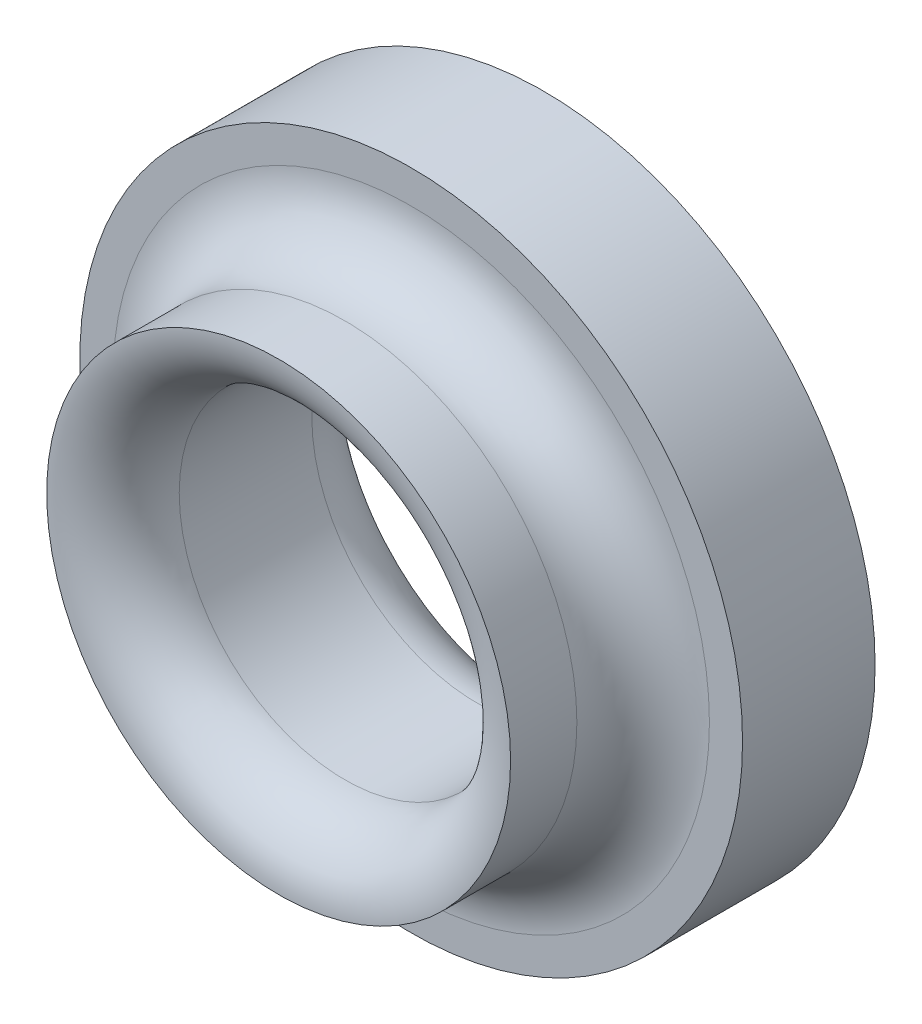
ISO-10303-21;
HEADER;
FILE_DESCRIPTION(('STEP AP214'),'2;1');
FILE_NAME('part.step','',(''),(''),'','','');
FILE_SCHEMA(('AUTOMOTIVE_DESIGN { 1 0 10303 214 1 1 1 1 }'));
ENDSEC;
DATA;
#1=APPLICATION_CONTEXT('core data for automotive mechanical design processes');
#2=APPLICATION_PROTOCOL_DEFINITION('international standard','automotive_design',2000,#1);
#3=PRODUCT_CONTEXT('',#1,'mechanical');
#4=PRODUCT('Part','Part','',(#3));
#5=PRODUCT_RELATED_PRODUCT_CATEGORY('part','',(#4));
#6=PRODUCT_DEFINITION_FORMATION('','',#4);
#7=PRODUCT_DEFINITION_CONTEXT('part definition',#1,'design');
#8=PRODUCT_DEFINITION('design','',#6,#7);
#9=PRODUCT_DEFINITION_SHAPE('','',#8);
#10=(LENGTH_UNIT() NAMED_UNIT(*) SI_UNIT(.MILLI.,.METRE.));
#11=(NAMED_UNIT(*) PLANE_ANGLE_UNIT() SI_UNIT($,.RADIAN.));
#12=(NAMED_UNIT(*) SI_UNIT($,.STERADIAN.) SOLID_ANGLE_UNIT());
#13=UNCERTAINTY_MEASURE_WITH_UNIT(LENGTH_MEASURE(1.E-05),#10,'distance_accuracy_value','');
#14=(GEOMETRIC_REPRESENTATION_CONTEXT(3) GLOBAL_UNCERTAINTY_ASSIGNED_CONTEXT((#13)) GLOBAL_UNIT_ASSIGNED_CONTEXT((#10,
#11,#12)) REPRESENTATION_CONTEXT('',''));
#15=CARTESIAN_POINT('',(0.,0.,0.));
#16=DIRECTION('',(0.,0.,1.));
#17=DIRECTION('',(1.,0.,0.));
#18=AXIS2_PLACEMENT_3D('',#15,#16,#17);
#19=CARTESIAN_POINT('',(0.,0.,2.));
#20=DIRECTION('',(0.,0.,-1.));
#21=DIRECTION('',(-1.,0.,0.));
#22=AXIS2_PLACEMENT_3D('',#19,#20,#21);
#23=CYLINDRICAL_SURFACE('',#22,5.);
#24=CARTESIAN_POINT('',(0.,0.,2.));
#25=DIRECTION('',(0.,0.,1.));
#26=DIRECTION('',(1.,0.,0.));
#27=AXIS2_PLACEMENT_3D('',#24,#25,#26);
#28=CIRCLE('',#27,5.);
#29=CARTESIAN_POINT('',(5.,0.,2.));
#30=VERTEX_POINT('',#29);
#31=EDGE_CURVE('E53',#30,#30,#28,.T.);
#32=ORIENTED_EDGE('',*,*,#31,.F.);
#33=EDGE_LOOP('',(#32));
#34=FACE_BOUND('',#33,.T.);
#35=CARTESIAN_POINT('',(0.,0.,0.));
#36=DIRECTION('',(0.,0.,1.));
#37=DIRECTION('',(1.,0.,0.));
#38=AXIS2_PLACEMENT_3D('',#35,#36,#37);
#39=CIRCLE('',#38,5.);
#40=CARTESIAN_POINT('',(5.,0.,0.));
#41=VERTEX_POINT('',#40);
#42=EDGE_CURVE('E54',#41,#41,#39,.T.);
#43=ORIENTED_EDGE('',*,*,#42,.T.);
#44=EDGE_LOOP('',(#43));
#45=FACE_BOUND('',#44,.T.);
#46=ADVANCED_FACE('F30',(#34,#45),#23,.T.);
#47=CARTESIAN_POINT('',(0.,0.,2.));
#48=DIRECTION('',(0.,0.,1.));
#49=DIRECTION('',(1.,0.,0.));
#50=AXIS2_PLACEMENT_3D('',#47,#48,#49);
#51=PLANE('',#50);
#52=CARTESIAN_POINT('',(0.,0.,2.));
#53=DIRECTION('',(0.,0.,1.));
#54=DIRECTION('',(1.,0.,0.));
#55=AXIS2_PLACEMENT_3D('',#52,#53,#54);
#56=CIRCLE('',#55,4.5);
#57=CARTESIAN_POINT('',(4.5,0.,2.));
#58=VERTEX_POINT('',#57);
#59=EDGE_CURVE('E10',#58,#58,#56,.F.);
#60=ORIENTED_EDGE('',*,*,#59,.T.);
#61=EDGE_LOOP('',(#60));
#62=FACE_BOUND('',#61,.T.);
#63=ORIENTED_EDGE('',*,*,#31,.T.);
#64=EDGE_LOOP('',(#63));
#65=FACE_BOUND('',#64,.T.);
#66=ADVANCED_FACE('F81',(#62,#65),#51,.T.);
#67=CARTESIAN_POINT('',(0.,0.,0.));
#68=DIRECTION('',(0.,0.,1.));
#69=DIRECTION('',(1.,0.,0.));
#70=AXIS2_PLACEMENT_3D('',#67,#68,#69);
#71=PLANE('',#70);
#72=CARTESIAN_POINT('',(0.,0.,0.));
#73=DIRECTION('',(0.,0.,1.));
#74=DIRECTION('',(1.,0.,0.));
#75=AXIS2_PLACEMENT_3D('',#72,#73,#74);
#76=CIRCLE('',#75,3.5);
#77=CARTESIAN_POINT('',(3.5,0.,0.));
#78=VERTEX_POINT('',#77);
#79=EDGE_CURVE('E50',#78,#78,#76,.T.);
#80=ORIENTED_EDGE('',*,*,#79,.T.);
#81=EDGE_LOOP('',(#80));
#82=FACE_BOUND('',#81,.T.);
#83=ORIENTED_EDGE('',*,*,#42,.F.);
#84=EDGE_LOOP('',(#83));
#85=FACE_BOUND('',#84,.T.);
#86=ADVANCED_FACE('F77',(#82,#85),#71,.F.);
#87=CARTESIAN_POINT('',(0.,0.,-8.));
#88=DIRECTION('',(0.,0.,1.));
#89=DIRECTION('',(1.,0.,0.));
#90=AXIS2_PLACEMENT_3D('',#87,#88,#89);
#91=CYLINDRICAL_SURFACE('',#90,2.5);
#92=CARTESIAN_POINT('',(0.,0.,3.));
#93=DIRECTION('',(0.,0.,1.));
#94=DIRECTION('',(1.,0.,0.));
#95=AXIS2_PLACEMENT_3D('',#92,#93,#94);
#96=CIRCLE('',#95,2.5);
#97=CARTESIAN_POINT('',(2.5,0.,3.));
#98=VERTEX_POINT('',#97);
#99=EDGE_CURVE('E41',#98,#98,#96,.T.);
#100=ORIENTED_EDGE('',*,*,#99,.T.);
#101=EDGE_LOOP('',(#100));
#102=FACE_BOUND('',#101,.T.);
#103=CARTESIAN_POINT('',(0.,0.,1.));
#104=DIRECTION('',(0.,0.,1.));
#105=DIRECTION('',(1.,0.,0.));
#106=AXIS2_PLACEMENT_3D('',#103,#104,#105);
#107=CIRCLE('',#106,2.5);
#108=CARTESIAN_POINT('',(2.5,0.,1.));
#109=VERTEX_POINT('',#108);
#110=EDGE_CURVE('E45',#109,#109,#107,.F.);
#111=ORIENTED_EDGE('',*,*,#110,.T.);
#112=EDGE_LOOP('',(#111));
#113=FACE_BOUND('',#112,.T.);
#114=ADVANCED_FACE('F69',(#102,#113),#91,.F.);
#115=CARTESIAN_POINT('',(0.,0.,4.));
#116=DIRECTION('',(0.,0.,-1.));
#117=DIRECTION('',(-1.,0.,0.));
#118=AXIS2_PLACEMENT_3D('',#115,#116,#117);
#119=CYLINDRICAL_SURFACE('',#118,3.5);
#120=CARTESIAN_POINT('',(0.,0.,3.));
#121=DIRECTION('',(0.,0.,1.));
#122=DIRECTION('',(1.,0.,0.));
#123=AXIS2_PLACEMENT_3D('',#120,#121,#122);
#124=CIRCLE('',#123,3.5);
#125=CARTESIAN_POINT('',(3.5,0.,3.));
#126=VERTEX_POINT('',#125);
#127=EDGE_CURVE('E37',#126,#126,#124,.T.);
#128=ORIENTED_EDGE('',*,*,#127,.T.);
#129=EDGE_LOOP('',(#128));
#130=FACE_BOUND('',#129,.T.);
#131=CARTESIAN_POINT('',(0.,0.,4.));
#132=DIRECTION('',(0.,0.,1.));
#133=DIRECTION('',(1.,0.,0.));
#134=AXIS2_PLACEMENT_3D('',#131,#132,#133);
#135=CIRCLE('',#134,3.5);
#136=CARTESIAN_POINT('',(3.5,0.,4.));
#137=VERTEX_POINT('',#136);
#138=EDGE_CURVE('E57',#137,#137,#135,.T.);
#139=ORIENTED_EDGE('',*,*,#138,.F.);
#140=EDGE_LOOP('',(#139));
#141=FACE_BOUND('',#140,.T.);
#142=ADVANCED_FACE('F66',(#130,#141),#119,.T.);
#143=CARTESIAN_POINT('',(0.,0.,1.));
#144=DIRECTION('',(0.,0.,1.));
#145=DIRECTION('',(1.,0.,0.));
#146=AXIS2_PLACEMENT_3D('',#143,#144,#145);
#147=TOROIDAL_SURFACE('',#146,3.5,1.);
#148=ORIENTED_EDGE('',*,*,#110,.F.);
#149=EDGE_LOOP('',(#148));
#150=FACE_BOUND('',#149,.T.);
#151=ORIENTED_EDGE('',*,*,#79,.F.);
#152=EDGE_LOOP('',(#151));
#153=FACE_BOUND('',#152,.T.);
#154=ADVANCED_FACE('F68',(#150,#153),#147,.T.);
#155=CARTESIAN_POINT('',(0.,0.,3.));
#156=DIRECTION('',(0.,0.,1.));
#157=DIRECTION('',(1.,0.,0.));
#158=AXIS2_PLACEMENT_3D('',#155,#156,#157);
#159=TOROIDAL_SURFACE('',#158,3.5,1.);
#160=ORIENTED_EDGE('',*,*,#138,.T.);
#161=EDGE_LOOP('',(#160));
#162=FACE_BOUND('',#161,.T.);
#163=ORIENTED_EDGE('',*,*,#99,.F.);
#164=EDGE_LOOP('',(#163));
#165=FACE_BOUND('',#164,.T.);
#166=ADVANCED_FACE('F63',(#162,#165),#159,.T.);
#167=CARTESIAN_POINT('',(0.,0.,3.));
#168=DIRECTION('',(0.,0.,1.));
#169=DIRECTION('',(1.,0.,0.));
#170=AXIS2_PLACEMENT_3D('',#167,#168,#169);
#171=TOROIDAL_SURFACE('',#170,4.5,1.);
#172=ORIENTED_EDGE('',*,*,#59,.F.);
#173=EDGE_LOOP('',(#172));
#174=FACE_BOUND('',#173,.T.);
#175=ORIENTED_EDGE('',*,*,#127,.F.);
#176=EDGE_LOOP('',(#175));
#177=FACE_BOUND('',#176,.T.);
#178=ADVANCED_FACE('F32',(#174,#177),#171,.F.);
#179=CLOSED_SHELL('',(#46,#66,#86,#114,#142,#154,#166,#178));
#180=MANIFOLD_SOLID_BREP('B2',#179);
#181=ADVANCED_BREP_SHAPE_REPRESENTATION('',(#18,#180),#14);
#182=SHAPE_DEFINITION_REPRESENTATION(#9,#181);
ENDSEC;
END-ISO-10303-21;
